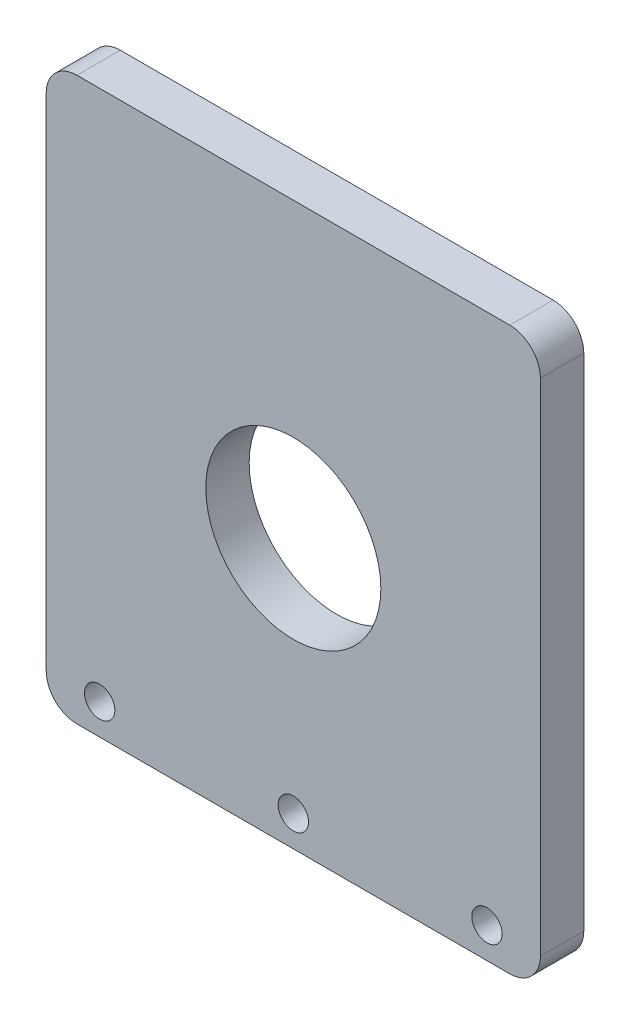
ISO-10303-21;
HEADER;
FILE_DESCRIPTION(('STEP AP214'),'2;1');
FILE_NAME('part.step','',(''),(''),'','','');
FILE_SCHEMA(('AUTOMOTIVE_DESIGN { 1 0 10303 214 1 1 1 1 }'));
ENDSEC;
DATA;
#1=APPLICATION_CONTEXT('core data for automotive mechanical design processes');
#2=APPLICATION_PROTOCOL_DEFINITION('international standard','automotive_design',2000,#1);
#3=PRODUCT_CONTEXT('',#1,'mechanical');
#4=PRODUCT('Part','Part','',(#3));
#5=PRODUCT_RELATED_PRODUCT_CATEGORY('part','',(#4));
#6=PRODUCT_DEFINITION_FORMATION('','',#4);
#7=PRODUCT_DEFINITION_CONTEXT('part definition',#1,'design');
#8=PRODUCT_DEFINITION('design','',#6,#7);
#9=PRODUCT_DEFINITION_SHAPE('','',#8);
#10=(LENGTH_UNIT() NAMED_UNIT(*) SI_UNIT(.MILLI.,.METRE.));
#11=(NAMED_UNIT(*) PLANE_ANGLE_UNIT() SI_UNIT($,.RADIAN.));
#12=(NAMED_UNIT(*) SI_UNIT($,.STERADIAN.) SOLID_ANGLE_UNIT());
#13=UNCERTAINTY_MEASURE_WITH_UNIT(LENGTH_MEASURE(1.E-05),#10,'distance_accuracy_value','');
#14=(GEOMETRIC_REPRESENTATION_CONTEXT(3) GLOBAL_UNCERTAINTY_ASSIGNED_CONTEXT((#13)) GLOBAL_UNIT_ASSIGNED_CONTEXT((#10,
#11,#12)) REPRESENTATION_CONTEXT('',''));
#15=CARTESIAN_POINT('',(0.,0.,0.));
#16=DIRECTION('',(0.,0.,1.));
#17=DIRECTION('',(1.,0.,0.));
#18=AXIS2_PLACEMENT_3D('',#15,#16,#17);
#19=CARTESIAN_POINT('',(-4581.5972929922,2322.68494965934,7.112));
#20=DIRECTION('',(1.,0.,0.));
#21=DIRECTION('',(0.,1.,0.));
#22=AXIS2_PLACEMENT_3D('',#19,#20,#21);
#23=PLANE('',#22);
#24=DIRECTION('',(0.,-1.,0.));
#25=VECTOR('',#24,1.);
#26=CARTESIAN_POINT('',(-4581.5972929922,2322.68494965934,0.));
#27=LINE('',#26,#25);
#28=CARTESIAN_POINT('',(-4581.5972929922,2459.27317809626,0.));
#29=VERTEX_POINT('',#28);
#30=CARTESIAN_POINT('',(-4581.5972929922,2377.22040635791,0.));
#31=VERTEX_POINT('',#30);
#32=EDGE_CURVE('E138',#29,#31,#27,.T.);
#33=ORIENTED_EDGE('',*,*,#32,.F.);
#34=DIRECTION('',(0.,0.,-1.));
#35=VECTOR('',#34,1.);
#36=CARTESIAN_POINT('',(-4581.5972929922,2459.27317809626,7.112));
#37=LINE('',#36,#35);
#38=CARTESIAN_POINT('',(-4581.5972929922,2459.27317809626,7.112));
#39=VERTEX_POINT('',#38);
#40=EDGE_CURVE('E11',#39,#29,#37,.T.);
#41=ORIENTED_EDGE('',*,*,#40,.F.);
#42=DIRECTION('',(0.,-1.,0.));
#43=VECTOR('',#42,1.);
#44=CARTESIAN_POINT('',(-4581.5972929922,2322.68494965934,7.112));
#45=LINE('',#44,#43);
#46=CARTESIAN_POINT('',(-4581.5972929922,2377.22040635791,7.112));
#47=VERTEX_POINT('',#46);
#48=EDGE_CURVE('E326',#39,#47,#45,.T.);
#49=ORIENTED_EDGE('',*,*,#48,.T.);
#50=DIRECTION('',(0.,0.,-1.));
#51=VECTOR('',#50,1.);
#52=CARTESIAN_POINT('',(-4581.5972929922,2377.22040635791,7.112));
#53=LINE('',#52,#51);
#54=EDGE_CURVE('E83',#47,#31,#53,.T.);
#55=ORIENTED_EDGE('',*,*,#54,.T.);
#56=EDGE_LOOP('',(#33,#41,#49,#55));
#57=FACE_BOUND('',#56,.T.);
#58=ADVANCED_FACE('F32',(#57),#23,.T.);
#59=CARTESIAN_POINT('',(-4586.6264929922,2459.27317809626,7.112));
#60=DIRECTION('',(0.,0.,-1.));
#61=DIRECTION('',(-1.,0.,0.));
#62=AXIS2_PLACEMENT_3D('',#59,#60,#61);
#63=CYLINDRICAL_SURFACE('',#62,5.02920000000007);
#64=CARTESIAN_POINT('',(-4586.6264929922,2459.27317809626,0.));
#65=DIRECTION('',(0.,0.,1.));
#66=DIRECTION('',(1.,0.,0.));
#67=AXIS2_PLACEMENT_3D('',#64,#65,#66);
#68=CIRCLE('',#67,5.02920000000007);
#69=CARTESIAN_POINT('',(-4586.6264929922,2464.30237809626,0.));
#70=VERTEX_POINT('',#69);
#71=EDGE_CURVE('E141',#29,#70,#68,.T.);
#72=ORIENTED_EDGE('',*,*,#71,.T.);
#73=DIRECTION('',(0.,0.,-1.));
#74=VECTOR('',#73,1.);
#75=CARTESIAN_POINT('',(-4586.6264929922,2464.30237809626,7.112));
#76=LINE('',#75,#74);
#77=CARTESIAN_POINT('',(-4586.6264929922,2464.30237809626,7.112));
#78=VERTEX_POINT('',#77);
#79=EDGE_CURVE('E41',#78,#70,#76,.T.);
#80=ORIENTED_EDGE('',*,*,#79,.F.);
#81=CARTESIAN_POINT('',(-4586.6264929922,2459.27317809626,7.112));
#82=DIRECTION('',(0.,0.,1.));
#83=DIRECTION('',(1.,0.,0.));
#84=AXIS2_PLACEMENT_3D('',#81,#82,#83);
#85=CIRCLE('',#84,5.02920000000007);
#86=EDGE_CURVE('E322',#39,#78,#85,.T.);
#87=ORIENTED_EDGE('',*,*,#86,.F.);
#88=ORIENTED_EDGE('',*,*,#40,.T.);
#89=EDGE_LOOP('',(#72,#80,#87,#88));
#90=FACE_BOUND('',#89,.T.);
#91=ADVANCED_FACE('F177',(#90),#63,.T.);
#92=CARTESIAN_POINT('',(-4622.1102929922,2464.30237809626,7.112));
#93=DIRECTION('',(0.,-1.,0.));
#94=DIRECTION('',(0.,0.,-1.));
#95=AXIS2_PLACEMENT_3D('',#92,#93,#94);
#96=PLANE('',#95);
#97=DIRECTION('',(-1.,0.,0.));
#98=VECTOR('',#97,1.);
#99=CARTESIAN_POINT('',(-4622.1102929922,2464.30237809626,0.));
#100=LINE('',#99,#98);
#101=CARTESIAN_POINT('',(-4657.5940929922,2464.30237809626,0.));
#102=VERTEX_POINT('',#101);
#103=EDGE_CURVE('E144',#70,#102,#100,.T.);
#104=ORIENTED_EDGE('',*,*,#103,.T.);
#105=DIRECTION('',(0.,0.,-1.));
#106=VECTOR('',#105,1.);
#107=CARTESIAN_POINT('',(-4657.5940929922,2464.30237809626,7.112));
#108=LINE('',#107,#106);
#109=CARTESIAN_POINT('',(-4657.5940929922,2464.30237809626,7.112));
#110=VERTEX_POINT('',#109);
#111=EDGE_CURVE('E165',#110,#102,#108,.T.);
#112=ORIENTED_EDGE('',*,*,#111,.F.);
#113=DIRECTION('',(-1.,0.,0.));
#114=VECTOR('',#113,1.);
#115=CARTESIAN_POINT('',(-4622.1102929922,2464.30237809626,7.112));
#116=LINE('',#115,#114);
#117=EDGE_CURVE('E173',#78,#110,#116,.T.);
#118=ORIENTED_EDGE('',*,*,#117,.F.);
#119=ORIENTED_EDGE('',*,*,#79,.T.);
#120=EDGE_LOOP('',(#104,#112,#118,#119));
#121=FACE_BOUND('',#120,.T.);
#122=ADVANCED_FACE('F170',(#121),#96,.F.);
#123=CARTESIAN_POINT('',(-4657.5940929922,2459.27317809626,7.112));
#124=DIRECTION('',(0.,0.,-1.));
#125=DIRECTION('',(-1.,0.,0.));
#126=AXIS2_PLACEMENT_3D('',#123,#124,#125);
#127=CYLINDRICAL_SURFACE('',#126,5.02920000000051);
#128=CARTESIAN_POINT('',(-4657.5940929922,2459.27317809626,0.));
#129=DIRECTION('',(0.,0.,1.));
#130=DIRECTION('',(1.,0.,0.));
#131=AXIS2_PLACEMENT_3D('',#128,#129,#130);
#132=CIRCLE('',#131,5.02920000000051);
#133=CARTESIAN_POINT('',(-4662.6232929922,2459.27317809626,0.));
#134=VERTEX_POINT('',#133);
#135=EDGE_CURVE('E147',#102,#134,#132,.T.);
#136=ORIENTED_EDGE('',*,*,#135,.T.);
#137=DIRECTION('',(0.,0.,-1.));
#138=VECTOR('',#137,1.);
#139=CARTESIAN_POINT('',(-4662.6232929922,2459.27317809626,7.112));
#140=LINE('',#139,#138);
#141=CARTESIAN_POINT('',(-4662.6232929922,2459.27317809626,7.112));
#142=VERTEX_POINT('',#141);
#143=EDGE_CURVE('E162',#142,#134,#140,.T.);
#144=ORIENTED_EDGE('',*,*,#143,.F.);
#145=CARTESIAN_POINT('',(-4657.5940929922,2459.27317809626,7.112));
#146=DIRECTION('',(0.,0.,1.));
#147=DIRECTION('',(1.,0.,0.));
#148=AXIS2_PLACEMENT_3D('',#145,#146,#147);
#149=CIRCLE('',#148,5.02920000000051);
#150=EDGE_CURVE('E320',#110,#142,#149,.T.);
#151=ORIENTED_EDGE('',*,*,#150,.F.);
#152=ORIENTED_EDGE('',*,*,#111,.T.);
#153=EDGE_LOOP('',(#136,#144,#151,#152));
#154=FACE_BOUND('',#153,.T.);
#155=ADVANCED_FACE('F233',(#154),#127,.T.);
#156=CARTESIAN_POINT('',(-4662.6232929922,2322.68494965933,7.112));
#157=DIRECTION('',(1.,0.,0.));
#158=DIRECTION('',(0.,1.,0.));
#159=AXIS2_PLACEMENT_3D('',#156,#157,#158);
#160=PLANE('',#159);
#161=DIRECTION('',(0.,-1.,0.));
#162=VECTOR('',#161,1.);
#163=CARTESIAN_POINT('',(-4662.6232929922,2322.68494965933,0.));
#164=LINE('',#163,#162);
#165=CARTESIAN_POINT('',(-4662.6232929922,2377.22040635791,0.));
#166=VERTEX_POINT('',#165);
#167=EDGE_CURVE('E150',#134,#166,#164,.T.);
#168=ORIENTED_EDGE('',*,*,#167,.T.);
#169=DIRECTION('',(0.,0.,-1.));
#170=VECTOR('',#169,1.);
#171=CARTESIAN_POINT('',(-4662.6232929922,2377.22040635791,7.112));
#172=LINE('',#171,#170);
#173=CARTESIAN_POINT('',(-4662.6232929922,2377.22040635791,7.112));
#174=VERTEX_POINT('',#173);
#175=EDGE_CURVE('E119',#174,#166,#172,.T.);
#176=ORIENTED_EDGE('',*,*,#175,.F.);
#177=DIRECTION('',(0.,-1.,0.));
#178=VECTOR('',#177,1.);
#179=CARTESIAN_POINT('',(-4662.6232929922,2322.68494965933,7.112));
#180=LINE('',#179,#178);
#181=EDGE_CURVE('E107',#142,#174,#180,.T.);
#182=ORIENTED_EDGE('',*,*,#181,.F.);
#183=ORIENTED_EDGE('',*,*,#143,.T.);
#184=EDGE_LOOP('',(#168,#176,#182,#183));
#185=FACE_BOUND('',#184,.T.);
#186=ADVANCED_FACE('F230',(#185),#160,.F.);
#187=CARTESIAN_POINT('',(-4657.5940929922,2377.22040635791,7.112));
#188=DIRECTION('',(0.,0.,-1.));
#189=DIRECTION('',(-1.,0.,0.));
#190=AXIS2_PLACEMENT_3D('',#187,#188,#189);
#191=CYLINDRICAL_SURFACE('',#190,5.02919999999984);
#192=CARTESIAN_POINT('',(-4657.5940929922,2377.22040635791,0.));
#193=DIRECTION('',(0.,0.,1.));
#194=DIRECTION('',(1.,0.,0.));
#195=AXIS2_PLACEMENT_3D('',#192,#193,#194);
#196=CIRCLE('',#195,5.02919999999984);
#197=CARTESIAN_POINT('',(-4657.5940929922,2372.19120635791,0.));
#198=VERTEX_POINT('',#197);
#199=EDGE_CURVE('E115',#166,#198,#196,.T.);
#200=ORIENTED_EDGE('',*,*,#199,.T.);
#201=DIRECTION('',(0.,0.,-1.));
#202=VECTOR('',#201,1.);
#203=CARTESIAN_POINT('',(-4657.5940929922,2372.19120635791,7.112));
#204=LINE('',#203,#202);
#205=CARTESIAN_POINT('',(-4657.5940929922,2372.19120635791,7.112));
#206=VERTEX_POINT('',#205);
#207=EDGE_CURVE('E113',#206,#198,#204,.T.);
#208=ORIENTED_EDGE('',*,*,#207,.F.);
#209=CARTESIAN_POINT('',(-4657.5940929922,2377.22040635791,7.112));
#210=DIRECTION('',(0.,0.,1.));
#211=DIRECTION('',(1.,0.,0.));
#212=AXIS2_PLACEMENT_3D('',#209,#210,#211);
#213=CIRCLE('',#212,5.02919999999984);
#214=EDGE_CURVE('E101',#174,#206,#213,.T.);
#215=ORIENTED_EDGE('',*,*,#214,.F.);
#216=ORIENTED_EDGE('',*,*,#175,.T.);
#217=EDGE_LOOP('',(#200,#208,#215,#216));
#218=FACE_BOUND('',#217,.T.);
#219=ADVANCED_FACE('F114',(#218),#191,.T.);
#220=CARTESIAN_POINT('',(-4622.1102929922,2372.19120635791,7.112));
#221=DIRECTION('',(0.,-1.,0.));
#222=DIRECTION('',(1.,0.,0.));
#223=AXIS2_PLACEMENT_3D('',#220,#221,#222);
#224=PLANE('',#223);
#225=DIRECTION('',(-1.,0.,0.));
#226=VECTOR('',#225,1.);
#227=CARTESIAN_POINT('',(-4622.1102929922,2372.19120635791,0.));
#228=LINE('',#227,#226);
#229=CARTESIAN_POINT('',(-4586.6264929922,2372.19120635791,0.));
#230=VERTEX_POINT('',#229);
#231=EDGE_CURVE('E154',#230,#198,#228,.T.);
#232=ORIENTED_EDGE('',*,*,#231,.F.);
#233=DIRECTION('',(0.,0.,-1.));
#234=VECTOR('',#233,1.);
#235=CARTESIAN_POINT('',(-4586.6264929922,2372.19120635791,7.112));
#236=LINE('',#235,#234);
#237=CARTESIAN_POINT('',(-4586.6264929922,2372.19120635791,7.112));
#238=VERTEX_POINT('',#237);
#239=EDGE_CURVE('E76',#238,#230,#236,.T.);
#240=ORIENTED_EDGE('',*,*,#239,.F.);
#241=DIRECTION('',(-1.,0.,0.));
#242=VECTOR('',#241,1.);
#243=CARTESIAN_POINT('',(-4622.1102929922,2372.19120635791,7.112));
#244=LINE('',#243,#242);
#245=EDGE_CURVE('E105',#238,#206,#244,.T.);
#246=ORIENTED_EDGE('',*,*,#245,.T.);
#247=ORIENTED_EDGE('',*,*,#207,.T.);
#248=EDGE_LOOP('',(#232,#240,#246,#247));
#249=FACE_BOUND('',#248,.T.);
#250=ADVANCED_FACE('F121',(#249),#224,.T.);
#251=CARTESIAN_POINT('',(-4622.1102929922,2377.22040635791,7.112));
#252=DIRECTION('',(0.,0.,-1.));
#253=DIRECTION('',(-1.,0.,0.));
#254=AXIS2_PLACEMENT_3D('',#251,#252,#253);
#255=CYLINDRICAL_SURFACE('',#254,2.4892000000003);
#256=CARTESIAN_POINT('',(-4622.1102929922,2377.22040635791,7.112));
#257=DIRECTION('',(0.,0.,1.));
#258=DIRECTION('',(1.,0.,0.));
#259=AXIS2_PLACEMENT_3D('',#256,#257,#258);
#260=CIRCLE('',#259,2.4892000000003);
#261=CARTESIAN_POINT('',(-4619.6210929922,2377.22040635791,7.112));
#262=VERTEX_POINT('',#261);
#263=EDGE_CURVE('E328',#262,#262,#260,.T.);
#264=ORIENTED_EDGE('',*,*,#263,.T.);
#265=EDGE_LOOP('',(#264));
#266=FACE_BOUND('',#265,.T.);
#267=CARTESIAN_POINT('',(-4622.1102929922,2377.22040635791,0.));
#268=DIRECTION('',(0.,0.,1.));
#269=DIRECTION('',(1.,0.,0.));
#270=AXIS2_PLACEMENT_3D('',#267,#268,#269);
#271=CIRCLE('',#270,2.4892000000003);
#272=CARTESIAN_POINT('',(-4619.6210929922,2377.22040635791,0.));
#273=VERTEX_POINT('',#272);
#274=EDGE_CURVE('E135',#273,#273,#271,.T.);
#275=ORIENTED_EDGE('',*,*,#274,.F.);
#276=EDGE_LOOP('',(#275));
#277=FACE_BOUND('',#276,.T.);
#278=ADVANCED_FACE('F188',(#266,#277),#255,.F.);
#279=CARTESIAN_POINT('',(-4622.1102929922,2416.28560635791,7.112));
#280=DIRECTION('',(0.,0.,-1.));
#281=DIRECTION('',(-1.,0.,0.));
#282=AXIS2_PLACEMENT_3D('',#279,#280,#281);
#283=CYLINDRICAL_SURFACE('',#282,14.3509999999996);
#284=CARTESIAN_POINT('',(-4622.1102929922,2416.28560635791,7.112));
#285=DIRECTION('',(0.,0.,1.));
#286=DIRECTION('',(1.,0.,0.));
#287=AXIS2_PLACEMENT_3D('',#284,#285,#286);
#288=CIRCLE('',#287,14.3509999999996);
#289=CARTESIAN_POINT('',(-4607.7592929922,2416.28560635791,7.112));
#290=VERTEX_POINT('',#289);
#291=EDGE_CURVE('E331',#290,#290,#288,.T.);
#292=ORIENTED_EDGE('',*,*,#291,.T.);
#293=EDGE_LOOP('',(#292));
#294=FACE_BOUND('',#293,.T.);
#295=CARTESIAN_POINT('',(-4622.1102929922,2416.28560635791,0.));
#296=DIRECTION('',(0.,0.,1.));
#297=DIRECTION('',(1.,0.,0.));
#298=AXIS2_PLACEMENT_3D('',#295,#296,#297);
#299=CIRCLE('',#298,14.3509999999996);
#300=CARTESIAN_POINT('',(-4607.7592929922,2416.28560635791,0.));
#301=VERTEX_POINT('',#300);
#302=EDGE_CURVE('E132',#301,#301,#299,.T.);
#303=ORIENTED_EDGE('',*,*,#302,.F.);
#304=EDGE_LOOP('',(#303));
#305=FACE_BOUND('',#304,.T.);
#306=ADVANCED_FACE('F191',(#294,#305),#283,.F.);
#307=CARTESIAN_POINT('',(-4590.3602929922,2377.22040635791,7.112));
#308=DIRECTION('',(0.,0.,-1.));
#309=DIRECTION('',(-1.,0.,0.));
#310=AXIS2_PLACEMENT_3D('',#307,#308,#309);
#311=CYLINDRICAL_SURFACE('',#310,2.48920000000012);
#312=CARTESIAN_POINT('',(-4590.3602929922,2377.22040635791,7.112));
#313=DIRECTION('',(0.,0.,1.));
#314=DIRECTION('',(1.,0.,0.));
#315=AXIS2_PLACEMENT_3D('',#312,#313,#314);
#316=CIRCLE('',#315,2.48920000000012);
#317=CARTESIAN_POINT('',(-4587.8710929922,2377.22040635791,7.112));
#318=VERTEX_POINT('',#317);
#319=EDGE_CURVE('E206',#318,#318,#316,.T.);
#320=ORIENTED_EDGE('',*,*,#319,.T.);
#321=EDGE_LOOP('',(#320));
#322=FACE_BOUND('',#321,.T.);
#323=CARTESIAN_POINT('',(-4590.3602929922,2377.22040635791,0.));
#324=DIRECTION('',(0.,0.,1.));
#325=DIRECTION('',(1.,0.,0.));
#326=AXIS2_PLACEMENT_3D('',#323,#324,#325);
#327=CIRCLE('',#326,2.48920000000012);
#328=CARTESIAN_POINT('',(-4587.8710929922,2377.22040635791,0.));
#329=VERTEX_POINT('',#328);
#330=EDGE_CURVE('E129',#329,#329,#327,.T.);
#331=ORIENTED_EDGE('',*,*,#330,.F.);
#332=EDGE_LOOP('',(#331));
#333=FACE_BOUND('',#332,.T.);
#334=ADVANCED_FACE('F194',(#322,#333),#311,.F.);
#335=CARTESIAN_POINT('',(-4653.8602929922,2377.22040635791,7.112));
#336=DIRECTION('',(0.,0.,-1.));
#337=DIRECTION('',(-1.,0.,0.));
#338=AXIS2_PLACEMENT_3D('',#335,#336,#337);
#339=CYLINDRICAL_SURFACE('',#338,2.4892000000003);
#340=CARTESIAN_POINT('',(-4653.8602929922,2377.22040635791,7.112));
#341=DIRECTION('',(0.,0.,1.));
#342=DIRECTION('',(1.,0.,0.));
#343=AXIS2_PLACEMENT_3D('',#340,#341,#342);
#344=CIRCLE('',#343,2.4892000000003);
#345=CARTESIAN_POINT('',(-4651.3710929922,2377.22040635791,7.112));
#346=VERTEX_POINT('',#345);
#347=EDGE_CURVE('E158',#346,#346,#344,.T.);
#348=ORIENTED_EDGE('',*,*,#347,.T.);
#349=EDGE_LOOP('',(#348));
#350=FACE_BOUND('',#349,.T.);
#351=CARTESIAN_POINT('',(-4653.8602929922,2377.22040635791,0.));
#352=DIRECTION('',(0.,0.,1.));
#353=DIRECTION('',(1.,0.,0.));
#354=AXIS2_PLACEMENT_3D('',#351,#352,#353);
#355=CIRCLE('',#354,2.4892000000003);
#356=CARTESIAN_POINT('',(-4651.3710929922,2377.22040635791,0.));
#357=VERTEX_POINT('',#356);
#358=EDGE_CURVE('E126',#357,#357,#355,.T.);
#359=ORIENTED_EDGE('',*,*,#358,.F.);
#360=EDGE_LOOP('',(#359));
#361=FACE_BOUND('',#360,.T.);
#362=ADVANCED_FACE('F34',(#350,#361),#339,.F.);
#363=CARTESIAN_POINT('',(-4586.6264929922,2377.22040635791,7.112));
#364=DIRECTION('',(0.,0.,-1.));
#365=DIRECTION('',(-1.,0.,0.));
#366=AXIS2_PLACEMENT_3D('',#363,#364,#365);
#367=CYLINDRICAL_SURFACE('',#366,5.02920000000029);
#368=CARTESIAN_POINT('',(-4586.6264929922,2377.22040635791,0.));
#369=DIRECTION('',(0.,0.,1.));
#370=DIRECTION('',(1.,0.,0.));
#371=AXIS2_PLACEMENT_3D('',#368,#369,#370);
#372=CIRCLE('',#371,5.02920000000029);
#373=EDGE_CURVE('E156',#230,#31,#372,.T.);
#374=ORIENTED_EDGE('',*,*,#373,.T.);
#375=ORIENTED_EDGE('',*,*,#54,.F.);
#376=CARTESIAN_POINT('',(-4586.6264929922,2377.22040635791,7.112));
#377=DIRECTION('',(0.,0.,1.));
#378=DIRECTION('',(1.,0.,0.));
#379=AXIS2_PLACEMENT_3D('',#376,#377,#378);
#380=CIRCLE('',#379,5.02920000000029);
#381=EDGE_CURVE('E49',#238,#47,#380,.T.);
#382=ORIENTED_EDGE('',*,*,#381,.F.);
#383=ORIENTED_EDGE('',*,*,#239,.T.);
#384=EDGE_LOOP('',(#374,#375,#382,#383));
#385=FACE_BOUND('',#384,.T.);
#386=ADVANCED_FACE('F201',(#385),#367,.T.);
#387=CARTESIAN_POINT('',(-4622.1102929922,2322.68494965934,7.112));
#388=DIRECTION('',(0.,0.,1.));
#389=DIRECTION('',(1.,0.,0.));
#390=AXIS2_PLACEMENT_3D('',#387,#388,#389);
#391=PLANE('',#390);
#392=ORIENTED_EDGE('',*,*,#347,.F.);
#393=EDGE_LOOP('',(#392));
#394=FACE_BOUND('',#393,.T.);
#395=ORIENTED_EDGE('',*,*,#319,.F.);
#396=EDGE_LOOP('',(#395));
#397=FACE_BOUND('',#396,.T.);
#398=ORIENTED_EDGE('',*,*,#291,.F.);
#399=EDGE_LOOP('',(#398));
#400=FACE_BOUND('',#399,.T.);
#401=ORIENTED_EDGE('',*,*,#263,.F.);
#402=EDGE_LOOP('',(#401));
#403=FACE_BOUND('',#402,.T.);
#404=ORIENTED_EDGE('',*,*,#48,.F.);
#405=ORIENTED_EDGE('',*,*,#86,.T.);
#406=ORIENTED_EDGE('',*,*,#117,.T.);
#407=ORIENTED_EDGE('',*,*,#150,.T.);
#408=ORIENTED_EDGE('',*,*,#181,.T.);
#409=ORIENTED_EDGE('',*,*,#214,.T.);
#410=ORIENTED_EDGE('',*,*,#245,.F.);
#411=ORIENTED_EDGE('',*,*,#381,.T.);
#412=EDGE_LOOP('',(#404,#405,#406,#407,#408,#409,#410,#411));
#413=FACE_BOUND('',#412,.T.);
#414=ADVANCED_FACE('F103',(#394,#397,#400,#403,#413),#391,.T.);
#415=CARTESIAN_POINT('',(-4622.1102929922,2322.68494965934,0.));
#416=DIRECTION('',(0.,0.,1.));
#417=DIRECTION('',(1.,0.,0.));
#418=AXIS2_PLACEMENT_3D('',#415,#416,#417);
#419=PLANE('',#418);
#420=ORIENTED_EDGE('',*,*,#358,.T.);
#421=EDGE_LOOP('',(#420));
#422=FACE_BOUND('',#421,.T.);
#423=ORIENTED_EDGE('',*,*,#330,.T.);
#424=EDGE_LOOP('',(#423));
#425=FACE_BOUND('',#424,.T.);
#426=ORIENTED_EDGE('',*,*,#302,.T.);
#427=EDGE_LOOP('',(#426));
#428=FACE_BOUND('',#427,.T.);
#429=ORIENTED_EDGE('',*,*,#274,.T.);
#430=EDGE_LOOP('',(#429));
#431=FACE_BOUND('',#430,.T.);
#432=ORIENTED_EDGE('',*,*,#32,.T.);
#433=ORIENTED_EDGE('',*,*,#373,.F.);
#434=ORIENTED_EDGE('',*,*,#231,.T.);
#435=ORIENTED_EDGE('',*,*,#199,.F.);
#436=ORIENTED_EDGE('',*,*,#167,.F.);
#437=ORIENTED_EDGE('',*,*,#135,.F.);
#438=ORIENTED_EDGE('',*,*,#103,.F.);
#439=ORIENTED_EDGE('',*,*,#71,.F.);
#440=EDGE_LOOP('',(#432,#433,#434,#435,#436,#437,#438,#439));
#441=FACE_BOUND('',#440,.T.);
#442=ADVANCED_FACE('F179',(#422,#425,#428,#431,#441),#419,.F.);
#443=CLOSED_SHELL('',(#58,#91,#122,#155,#186,#219,#250,#278,#306,#334,#362,#386,#414,#442));
#444=MANIFOLD_SOLID_BREP('B2',#443);
#445=ADVANCED_BREP_SHAPE_REPRESENTATION('',(#18,#444),#14);
#446=SHAPE_DEFINITION_REPRESENTATION(#9,#445);
ENDSEC;
END-ISO-10303-21;
